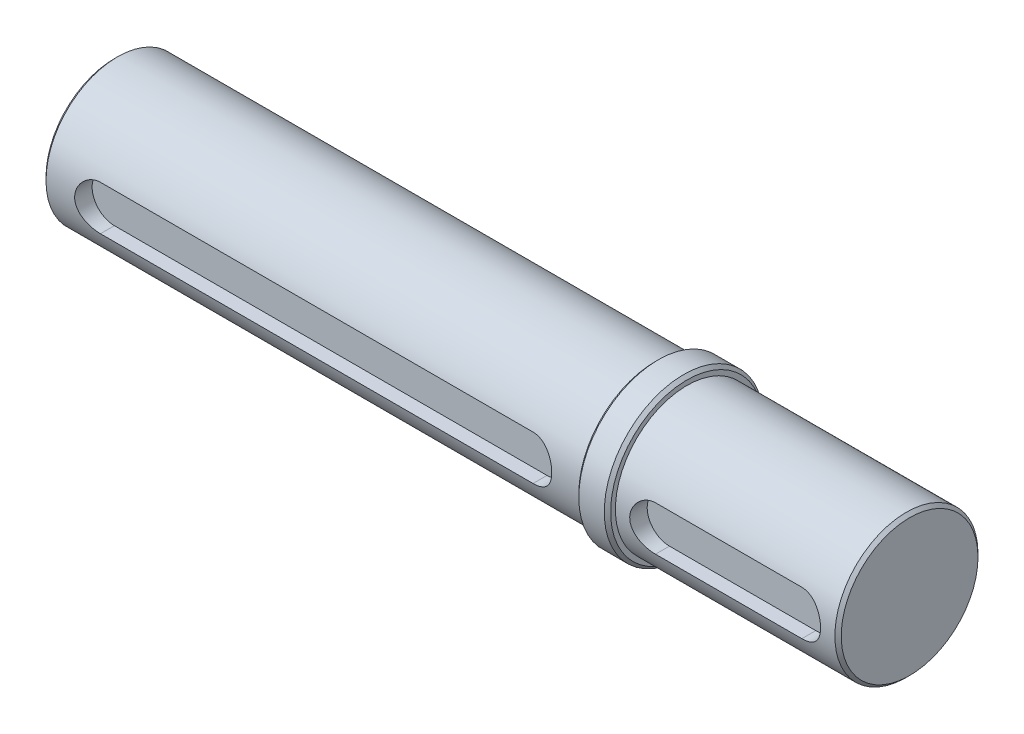
ISO-10303-21;
HEADER;
FILE_DESCRIPTION(('STEP AP214'),'2;1');
FILE_NAME('part.step','',(''),(''),'','','');
FILE_SCHEMA(('AUTOMOTIVE_DESIGN { 1 0 10303 214 1 1 1 1 }'));
ENDSEC;
DATA;
#1=APPLICATION_CONTEXT('core data for automotive mechanical design processes');
#2=APPLICATION_PROTOCOL_DEFINITION('international standard','automotive_design',2000,#1);
#3=PRODUCT_CONTEXT('',#1,'mechanical');
#4=PRODUCT('Part','Part','',(#3));
#5=PRODUCT_RELATED_PRODUCT_CATEGORY('part','',(#4));
#6=PRODUCT_DEFINITION_FORMATION('','',#4);
#7=PRODUCT_DEFINITION_CONTEXT('part definition',#1,'design');
#8=PRODUCT_DEFINITION('design','',#6,#7);
#9=PRODUCT_DEFINITION_SHAPE('','',#8);
#10=(LENGTH_UNIT() NAMED_UNIT(*) SI_UNIT(.MILLI.,.METRE.));
#11=(NAMED_UNIT(*) PLANE_ANGLE_UNIT() SI_UNIT($,.RADIAN.));
#12=(NAMED_UNIT(*) SI_UNIT($,.STERADIAN.) SOLID_ANGLE_UNIT());
#13=UNCERTAINTY_MEASURE_WITH_UNIT(LENGTH_MEASURE(1.E-05),#10,'distance_accuracy_value','');
#14=(GEOMETRIC_REPRESENTATION_CONTEXT(3) GLOBAL_UNCERTAINTY_ASSIGNED_CONTEXT((#13)) GLOBAL_UNIT_ASSIGNED_CONTEXT((#10,
#11,#12)) REPRESENTATION_CONTEXT('',''));
#15=CARTESIAN_POINT('',(0.,0.,0.));
#16=DIRECTION('',(0.,0.,1.));
#17=DIRECTION('',(1.,0.,0.));
#18=AXIS2_PLACEMENT_3D('',#15,#16,#17);
#19=CARTESIAN_POINT('',(0.,0.,0.));
#20=DIRECTION('',(-1.,0.,0.));
#21=DIRECTION('',(0.,0.,1.));
#22=AXIS2_PLACEMENT_3D('',#19,#20,#21);
#23=PLANE('',#22);
#24=CARTESIAN_POINT('',(0.,0.,0.));
#25=DIRECTION('',(-1.,0.,0.));
#26=DIRECTION('',(0.,0.,1.));
#27=AXIS2_PLACEMENT_3D('',#24,#25,#26);
#28=CIRCLE('',#27,21.5);
#29=CARTESIAN_POINT('',(0.,0.,21.5));
#30=VERTEX_POINT('',#29);
#31=EDGE_CURVE('E187',#30,#30,#28,.T.);
#32=ORIENTED_EDGE('',*,*,#31,.T.);
#33=EDGE_LOOP('',(#32));
#34=FACE_BOUND('',#33,.T.);
#35=CARTESIAN_POINT('',(0.,0.,0.));
#36=DIRECTION('',(-1.,0.,0.));
#37=DIRECTION('',(0.,0.,1.));
#38=AXIS2_PLACEMENT_3D('',#35,#36,#37);
#39=CIRCLE('',#38,4.24999999999999);
#40=CARTESIAN_POINT('',(0.,0.,4.24999999999999));
#41=VERTEX_POINT('',#40);
#42=EDGE_CURVE('E159',#41,#41,#39,.T.);
#43=ORIENTED_EDGE('',*,*,#42,.F.);
#44=EDGE_LOOP('',(#43));
#45=FACE_BOUND('',#44,.T.);
#46=ADVANCED_FACE('F45',(#34,#45),#23,.T.);
#47=CARTESIAN_POINT('',(0.,0.,0.));
#48=DIRECTION('',(1.,0.,0.));
#49=DIRECTION('',(0.,0.,-1.));
#50=AXIS2_PLACEMENT_3D('',#47,#48,#49);
#51=CYLINDRICAL_SURFACE('',#50,22.5);
#52=CARTESIAN_POINT('',(153.,-6.99999999999998,21.3834047803431));
#53=CARTESIAN_POINT('',(153.191747962933,-7.00002638788771,21.3833759755726));
#54=CARTESIAN_POINT('',(153.383485321504,-6.99212250357731,21.3859829575454));
#55=CARTESIAN_POINT('',(153.765489058962,-6.96064990633981,21.3962580072183));
#56=CARTESIAN_POINT('',(153.955755778655,-6.93708493994701,21.4039248644627));
#57=CARTESIAN_POINT('',(154.332958103102,-6.87456915635525,21.4240824611325));
#58=CARTESIAN_POINT('',(154.519901235473,-6.83565951993685,21.4365602872848));
#59=CARTESIAN_POINT('',(154.88966229555,-6.74281154744466,21.4659469063578));
#60=CARTESIAN_POINT('',(155.072480102144,-6.68887277075805,21.4828558291851));
#61=CARTESIAN_POINT('',(155.432628173539,-6.56646575510684,21.5205859002674));
#62=CARTESIAN_POINT('',(155.609961967382,-6.49800709263032,21.5414044689111));
#63=CARTESIAN_POINT('',(155.958189970023,-6.34705748516683,21.5863628741255));
#64=CARTESIAN_POINT('',(156.129081759612,-6.26456133146704,21.6105039428957));
#65=CARTESIAN_POINT('',(156.463322979925,-6.08615523684719,21.6614246049305));
#66=CARTESIAN_POINT('',(156.626671560951,-5.99024378964968,21.6882044943834));
#67=CARTESIAN_POINT('',(156.944892740823,-5.78563893862382,21.7436799451747));
#68=CARTESIAN_POINT('',(157.099762274424,-5.67694095648713,21.7723761910783));
#69=CARTESIAN_POINT('',(157.404649878951,-5.44398558349852,21.8318094528287));
#70=CARTESIAN_POINT('',(157.554375697672,-5.31935461263557,21.8625820218381));
#71=CARTESIAN_POINT('',(157.842885258309,-5.05809625572506,21.9244995602668));
#72=CARTESIAN_POINT('',(157.981668816275,-4.92146866808486,21.9556445359364));
#73=CARTESIAN_POINT('',(158.247469283069,-4.63702147167282,22.0174752796029));
#74=CARTESIAN_POINT('',(158.374482110225,-4.48919801262153,22.0481608852367));
#75=CARTESIAN_POINT('',(158.615815118575,-4.18336601580312,22.1082274768052));
#76=CARTESIAN_POINT('',(158.730139713703,-4.02536105036414,22.1376089142809));
#77=CARTESIAN_POINT('',(158.94782013432,-3.69637926494409,22.1949382761817));
#78=CARTESIAN_POINT('',(159.050865802136,-3.52518859648668,22.222838133295));
#79=CARTESIAN_POINT('',(159.242077396034,-3.17432985879871,22.2756613074277));
#80=CARTESIAN_POINT('',(159.33024877474,-2.99466492710897,22.3005857142056));
#81=CARTESIAN_POINT('',(159.491027505679,-2.62804567748407,22.3467560378169));
#82=CARTESIAN_POINT('',(159.563635279951,-2.44109155737343,22.3680020543947));
#83=CARTESIAN_POINT('',(159.692644415018,-2.06124657398026,22.4061975627029));
#84=CARTESIAN_POINT('',(159.749046375157,-1.86835593054215,22.4231472133242));
#85=CARTESIAN_POINT('',(159.843645794008,-1.48406965496813,22.4518043567541));
#86=CARTESIAN_POINT('',(159.882347442615,-1.29280885191943,22.4636563728524));
#87=CARTESIAN_POINT('',(159.943666983921,-0.907492281435927,22.4825189363242));
#88=CARTESIAN_POINT('',(159.966285431422,-0.713436610647583,22.4895296507013));
#89=CARTESIAN_POINT('',(159.995221071183,-0.324029619574403,22.4985094688896));
#90=CARTESIAN_POINT('',(160.001540971608,-0.12867851994682,22.5004794102745));
#91=CARTESIAN_POINT('',(159.997825624669,0.261850976266974,22.4993235348161));
#92=CARTESIAN_POINT('',(159.987790702297,0.457029376207832,22.4961978192299));
#93=CARTESIAN_POINT('',(159.952091279248,0.839016651756687,22.4851350756934));
#94=CARTESIAN_POINT('',(159.926977198409,1.02588219704708,22.4773675290497));
#95=CARTESIAN_POINT('',(159.861806715502,1.39681014394022,22.4573691656826));
#96=CARTESIAN_POINT('',(159.821745326667,1.58087158867604,22.4451368594423));
#97=CARTESIAN_POINT('',(159.727040771032,1.9448049822526,22.4165350301791));
#98=CARTESIAN_POINT('',(159.672402466504,2.12467830636908,22.4001668868012));
#99=CARTESIAN_POINT('',(159.548962208332,2.47918052521276,22.3637078769714));
#100=CARTESIAN_POINT('',(159.480154922154,2.65380741699503,22.3436156092208));
#101=CARTESIAN_POINT('',(159.328027310215,2.99866751070753,22.2999677081418));
#102=CARTESIAN_POINT('',(159.244545249901,3.1688245114741,22.2763739905048));
#103=CARTESIAN_POINT('',(159.064226510845,3.50156811170553,22.2265007734939));
#104=CARTESIAN_POINT('',(158.967385253138,3.66415208979078,22.2002203540359));
#105=CARTESIAN_POINT('',(158.761038630503,3.98072025747788,22.1456467231703));
#106=CARTESIAN_POINT('',(158.651532951898,4.13470423393205,22.1173534619146));
#107=CARTESIAN_POINT('',(158.420570196103,4.43317367604059,22.0594670226099));
#108=CARTESIAN_POINT('',(158.299112742727,4.57765884247862,22.0298738036607));
#109=CARTESIAN_POINT('',(158.039724709995,4.86207108102337,21.9688936108202));
#110=CARTESIAN_POINT('',(157.901320039388,5.0015610920034,21.9374831254957));
#111=CARTESIAN_POINT('',(157.613294186339,5.26840074524966,21.8749338799794));
#112=CARTESIAN_POINT('',(157.463676595185,5.39575424517762,21.8437950363228));
#113=CARTESIAN_POINT('',(157.154016640235,5.63762072887128,21.7826262792731));
#114=CARTESIAN_POINT('',(156.993967320647,5.75212500350362,21.7525971271591));
#115=CARTESIAN_POINT('',(156.664603799852,5.96735827855914,21.6945398510365));
#116=CARTESIAN_POINT('',(156.495293241572,6.06809264161731,21.6665109500826));
#117=CARTESIAN_POINT('',(156.14635431279,6.25621355677313,21.6129469743072));
#118=CARTESIAN_POINT('',(155.966626662005,6.34342581409759,21.5874457842966));
#119=CARTESIAN_POINT('',(155.60003436718,6.5022849484282,21.5401290954628));
#120=CARTESIAN_POINT('',(155.413172696296,6.57393822826239,21.5183120813529));
#121=CARTESIAN_POINT('',(155.033782862087,6.70102264969054,21.4790763704547));
#122=CARTESIAN_POINT('',(154.841260960584,6.75647102650286,21.4616530033951));
#123=CARTESIAN_POINT('',(154.451885948128,6.85070294339751,21.4317592713336));
#124=CARTESIAN_POINT('',(154.255034871999,6.88949414394964,21.4192866297424));
#125=CARTESIAN_POINT('',(153.881992589154,6.9464619866315,21.4008759333036));
#126=CARTESIAN_POINT('',(153.706118439217,6.96653718585294,21.3943385336146));
#127=CARTESIAN_POINT('',(153.353500657659,6.99330547974967,21.3855959359006));
#128=CARTESIAN_POINT('',(153.176758618322,7.0000175656023,21.3833845899213));
#129=CARTESIAN_POINT('',(153.,7.00000000000003,21.3834047803431));
#130=B_SPLINE_CURVE_WITH_KNOTS('',3,(#52,#53,#54,#55,#56,#57,#58,#59,#60,#61,#62,#63,#64,#65,
#66,#67,#68,#69,#70,#71,#72,#73,#74,#75,#76,#77,#78,#79,#80,#81,#82,#83,#84,#85,#86,#87,#88,#89,
#90,#91,#92,#93,#94,#95,#96,#97,#98,#99,#100,#101,#102,#103,#104,#105,#106,#107,#108,#109,#110,
#111,#112,#113,#114,#115,#116,#117,#118,#119,#120,#121,#122,#123,#124,#125,#126,#127,#128,#129),
.UNSPECIFIED.,.F.,.F.,(4,2,2,2,2,2,2,2,2,2,2,2,2,2,2,2,2,2,2,2,2,2,2,2,2,2,2,2,2,2,2,2,2,2,2,2,
2,2,4),(0.,0.575046969806876,1.14995642305857,1.72333336736907,2.29672712327432,
2.86974387087755,3.44297370600939,4.01626795548502,4.58976810539891,5.18076864034281,
5.77177910843488,6.36299375708566,6.95400208730357,7.55850874723004,8.1627933229332,
8.76706151008845,9.37130734653419,9.95706552574569,10.5428034978567,11.1284441375358,
11.7140731399452,12.2795246614735,12.8451649995771,13.4106168982253,13.9762819963941,
14.5486246379559,15.1211639439558,15.6937174338258,16.2662889507273,16.8625896714317,
17.4587002177891,18.055212394766,18.6514915966369,19.2549115963138,19.8580828040919,
20.4606101364131,21.0628600748604,21.5937197869136,22.1238245201084),.UNSPECIFIED.);
#131=CARTESIAN_POINT('',(153.,-6.99999999999998,21.3834047803431));
#132=VERTEX_POINT('',#131);
#133=CARTESIAN_POINT('',(153.,7.00000000000003,21.3834047803431));
#134=VERTEX_POINT('',#133);
#135=EDGE_CURVE('E243',#132,#134,#130,.T.);
#136=ORIENTED_EDGE('',*,*,#135,.F.);
#137=DIRECTION('',(1.,0.,0.));
#138=VECTOR('',#137,1.);
#139=CARTESIAN_POINT('',(0.,-7.,21.3834047803431));
#140=LINE('',#139,#138);
#141=CARTESIAN_POINT('',(17.,-7.,21.3834047803431));
#142=VERTEX_POINT('',#141);
#143=EDGE_CURVE('E11',#142,#132,#140,.T.);
#144=ORIENTED_EDGE('',*,*,#143,.F.);
#145=CARTESIAN_POINT('',(17.,7.,21.3834047803431));
#146=CARTESIAN_POINT('',(16.8082520370671,7.00002638788773,21.3833759755726));
#147=CARTESIAN_POINT('',(16.6165146784963,6.99212250357733,21.3859829575454));
#148=CARTESIAN_POINT('',(16.2345109410377,6.96064990633983,21.3962580072183));
#149=CARTESIAN_POINT('',(16.0442442213453,6.93708493994703,21.4039248644627));
#150=CARTESIAN_POINT('',(15.6670418968984,6.87456915635527,21.4240824611325));
#151=CARTESIAN_POINT('',(15.4800987645274,6.83565951993687,21.4365602872848));
#152=CARTESIAN_POINT('',(15.1103377044495,6.74281154744467,21.4659469063578));
#153=CARTESIAN_POINT('',(14.9275198978557,6.68887277075807,21.4828558291851));
#154=CARTESIAN_POINT('',(14.5673718264613,6.56646575510685,21.5205859002674));
#155=CARTESIAN_POINT('',(14.3900380326178,6.49800709263033,21.5414044689111));
#156=CARTESIAN_POINT('',(14.0418100299767,6.34705748516684,21.5863628741255));
#157=CARTESIAN_POINT('',(13.8709182403882,6.26456133146705,21.6105039428957));
#158=CARTESIAN_POINT('',(13.5366770200747,6.0861552368472,21.6614246049305));
#159=CARTESIAN_POINT('',(13.3733284390492,5.99024378964968,21.6882044943834));
#160=CARTESIAN_POINT('',(13.0551072591769,5.78563893862382,21.7436799451747));
#161=CARTESIAN_POINT('',(12.9002377255763,5.67694095648713,21.7723761910783));
#162=CARTESIAN_POINT('',(12.5953501210494,5.44398558349853,21.8318094528287));
#163=CARTESIAN_POINT('',(12.4456243023278,5.31935461263558,21.8625820218381));
#164=CARTESIAN_POINT('',(12.1571147416907,5.05809625572507,21.9244995602668));
#165=CARTESIAN_POINT('',(12.0183311837246,4.92146866808487,21.9556445359364));
#166=CARTESIAN_POINT('',(11.7525307169311,4.63702147167283,22.0174752796029));
#167=CARTESIAN_POINT('',(11.6255178897753,4.48919801262155,22.0481608852367));
#168=CARTESIAN_POINT('',(11.384184881425,4.18336601580314,22.1082274768052));
#169=CARTESIAN_POINT('',(11.2698602862973,4.02536105036415,22.1376089142809));
#170=CARTESIAN_POINT('',(11.05217986568,3.6963792649441,22.1949382761817));
#171=CARTESIAN_POINT('',(10.9491341978637,3.5251885964867,22.222838133295));
#172=CARTESIAN_POINT('',(10.7579226039664,3.17432985879872,22.2756613074277));
#173=CARTESIAN_POINT('',(10.66975122526,2.99466492710898,22.3005857142056));
#174=CARTESIAN_POINT('',(10.5089724943215,2.62804567748407,22.3467560378169));
#175=CARTESIAN_POINT('',(10.4363647200488,2.44109155737343,22.3680020543947));
#176=CARTESIAN_POINT('',(10.3073555849817,2.06124657398027,22.4061975627029));
#177=CARTESIAN_POINT('',(10.2509536248428,1.86835593054215,22.4231472133242));
#178=CARTESIAN_POINT('',(10.1563542059918,1.48406965496813,22.4518043567541));
#179=CARTESIAN_POINT('',(10.1176525573853,1.29280885191943,22.4636563728524));
#180=CARTESIAN_POINT('',(10.0563330160787,0.907492281435925,22.4825189363242));
#181=CARTESIAN_POINT('',(10.0337145685779,0.71343661064758,22.4895296507013));
#182=CARTESIAN_POINT('',(10.0047789288171,0.324029619574398,22.4985094688896));
#183=CARTESIAN_POINT('',(9.99845902839227,0.128678519946814,22.5004794102745));
#184=CARTESIAN_POINT('',(10.0021743753308,-0.261850976266982,22.4993235348161));
#185=CARTESIAN_POINT('',(10.0122092977033,-0.457029376207841,22.4961978192299));
#186=CARTESIAN_POINT('',(10.0479087207522,-0.839016651756698,22.4851350756934));
#187=CARTESIAN_POINT('',(10.0730228015911,-1.0258821970471,22.4773675290497));
#188=CARTESIAN_POINT('',(10.1381932844985,-1.39681014394023,22.4573691656826));
#189=CARTESIAN_POINT('',(10.1782546733331,-1.58087158867605,22.4451368594423));
#190=CARTESIAN_POINT('',(10.2729592289679,-1.94480498225261,22.4165350301791));
#191=CARTESIAN_POINT('',(10.327597533496,-2.12467830636909,22.4001668868012));
#192=CARTESIAN_POINT('',(10.4510377916683,-2.47918052521277,22.3637078769714));
#193=CARTESIAN_POINT('',(10.5198450778458,-2.65380741699504,22.3436156092208));
#194=CARTESIAN_POINT('',(10.6719726897852,-2.99866751070754,22.2999677081418));
#195=CARTESIAN_POINT('',(10.7554547500993,-3.16882451147411,22.2763739905048));
#196=CARTESIAN_POINT('',(10.9357734891551,-3.50156811170554,22.2265007734939));
#197=CARTESIAN_POINT('',(11.0326147468621,-3.66415208979079,22.2002203540359));
#198=CARTESIAN_POINT('',(11.2389613694973,-3.98072025747788,22.1456467231703));
#199=CARTESIAN_POINT('',(11.3484670481018,-4.13470423393206,22.1173534619146));
#200=CARTESIAN_POINT('',(11.5794298038973,-4.4331736760406,22.0594670226099));
#201=CARTESIAN_POINT('',(11.7008872572734,-4.57765884247863,22.0298738036607));
#202=CARTESIAN_POINT('',(11.9602752900053,-4.86207108102338,21.9688936108202));
#203=CARTESIAN_POINT('',(12.0986799606122,-5.00156109200341,21.9374831254957));
#204=CARTESIAN_POINT('',(12.3867058136609,-5.26840074524967,21.8749338799794));
#205=CARTESIAN_POINT('',(12.5363234048154,-5.39575424517763,21.8437950363228));
#206=CARTESIAN_POINT('',(12.8459833597652,-5.63762072887128,21.7826262792731));
#207=CARTESIAN_POINT('',(13.0060326793534,-5.75212500350363,21.7525971271591));
#208=CARTESIAN_POINT('',(13.335396200148,-5.96735827855914,21.6945398510365));
#209=CARTESIAN_POINT('',(13.5047067584282,-6.06809264161731,21.6665109500826));
#210=CARTESIAN_POINT('',(13.8536456872099,-6.25621355677312,21.6129469743072));
#211=CARTESIAN_POINT('',(14.0333733379948,-6.34342581409758,21.5874457842966));
#212=CARTESIAN_POINT('',(14.3999656328203,-6.50228494842818,21.5401290954628));
#213=CARTESIAN_POINT('',(14.5868273037043,-6.57393822826236,21.5183120813529));
#214=CARTESIAN_POINT('',(14.9662171379128,-6.70102264969051,21.4790763704547));
#215=CARTESIAN_POINT('',(15.1587390394159,-6.75647102650283,21.4616530033951));
#216=CARTESIAN_POINT('',(15.5481140518722,-6.85070294339748,21.4317592713336));
#217=CARTESIAN_POINT('',(15.7449651280007,-6.88949414394962,21.4192866297424));
#218=CARTESIAN_POINT('',(16.1180074108463,-6.94646198663148,21.4008759333036));
#219=CARTESIAN_POINT('',(16.2938815607828,-6.96653718585291,21.3943385336146));
#220=CARTESIAN_POINT('',(16.6464993423408,-6.99330547974964,21.3855959359006));
#221=CARTESIAN_POINT('',(16.8232413816784,-7.00001756560227,21.3833845899213));
#222=CARTESIAN_POINT('',(17.,-7.,21.3834047803431));
#223=B_SPLINE_CURVE_WITH_KNOTS('',3,(#145,#146,#147,#148,#149,#150,#151,#152,#153,#154,#155,
#156,#157,#158,#159,#160,#161,#162,#163,#164,#165,#166,#167,#168,#169,#170,#171,#172,#173,#174,
#175,#176,#177,#178,#179,#180,#181,#182,#183,#184,#185,#186,#187,#188,#189,#190,#191,#192,#193,
#194,#195,#196,#197,#198,#199,#200,#201,#202,#203,#204,#205,#206,#207,#208,#209,#210,#211,#212,
#213,#214,#215,#216,#217,#218,#219,#220,#221,#222),.UNSPECIFIED.,.F.,.F.,(4,2,2,2,2,2,2,2,2,2,2,
2,2,2,2,2,2,2,2,2,2,2,2,2,2,2,2,2,2,2,2,2,2,2,2,2,2,2,4),(0.,0.57504696980687,1.14995642305858,
1.72333336736907,2.29672712327433,2.86974387087759,3.44297370600941,4.01626795548503,
4.58976810539893,5.18076864034279,5.77177910843488,6.36299375708563,6.95400208730355,
7.55850874723002,8.16279332293319,8.76706151008845,9.37130734653418,9.95706552574569,
10.5428034978567,11.1284441375358,11.7140731399452,12.2795246614735,12.8451649995772,
13.4106168982253,13.9762819963941,14.5486246379559,15.1211639439558,15.6937174338258,
16.2662889507273,16.8625896714317,17.4587002177891,18.055212394766,18.6514915966369,
19.2549115963138,19.8580828040919,20.460610136413,21.0628600748604,21.5937197869136,
22.1238245201084),.UNSPECIFIED.);
#224=CARTESIAN_POINT('',(17.,7.,21.3834047803431));
#225=VERTEX_POINT('',#224);
#226=EDGE_CURVE('E54',#225,#142,#223,.T.);
#227=ORIENTED_EDGE('',*,*,#226,.F.);
#228=DIRECTION('',(1.,0.,0.));
#229=VECTOR('',#228,1.);
#230=CARTESIAN_POINT('',(0.,7.,21.3834047803431));
#231=LINE('',#230,#229);
#232=EDGE_CURVE('E251',#134,#225,#231,.F.);
#233=ORIENTED_EDGE('',*,*,#232,.F.);
#234=EDGE_LOOP('',(#136,#144,#227,#233));
#235=FACE_BOUND('',#234,.T.);
#236=CARTESIAN_POINT('',(0.999999999999984,0.,0.));
#237=DIRECTION('',(-1.,0.,0.));
#238=DIRECTION('',(0.,0.,1.));
#239=AXIS2_PLACEMENT_3D('',#236,#237,#238);
#240=CIRCLE('',#239,22.5);
#241=CARTESIAN_POINT('',(0.999999999999984,0.,22.5));
#242=VERTEX_POINT('',#241);
#243=EDGE_CURVE('E184',#242,#242,#240,.F.);
#244=ORIENTED_EDGE('',*,*,#243,.T.);
#245=EDGE_LOOP('',(#244));
#246=FACE_BOUND('',#245,.T.);
#247=CARTESIAN_POINT('',(170.,0.,0.));
#248=DIRECTION('',(1.,0.,0.));
#249=DIRECTION('',(0.,0.,-1.));
#250=AXIS2_PLACEMENT_3D('',#247,#248,#249);
#251=CIRCLE('',#250,22.5);
#252=CARTESIAN_POINT('',(170.,0.,-22.5));
#253=VERTEX_POINT('',#252);
#254=EDGE_CURVE('E175',#253,#253,#251,.T.);
#255=ORIENTED_EDGE('',*,*,#254,.F.);
#256=EDGE_LOOP('',(#255));
#257=FACE_BOUND('',#256,.T.);
#258=ADVANCED_FACE('F252',(#235,#246,#257),#51,.T.);
#259=CARTESIAN_POINT('',(170.,22.5,0.));
#260=DIRECTION('',(-1.,0.,0.));
#261=DIRECTION('',(0.,0.,1.));
#262=AXIS2_PLACEMENT_3D('',#259,#260,#261);
#263=PLANE('',#262);
#264=CARTESIAN_POINT('',(170.,0.,0.));
#265=DIRECTION('',(-1.,0.,0.));
#266=DIRECTION('',(0.,0.,1.));
#267=AXIS2_PLACEMENT_3D('',#264,#265,#266);
#268=CIRCLE('',#267,24.);
#269=CARTESIAN_POINT('',(170.,0.,24.));
#270=VERTEX_POINT('',#269);
#271=EDGE_CURVE('E196',#270,#270,#268,.T.);
#272=ORIENTED_EDGE('',*,*,#271,.T.);
#273=EDGE_LOOP('',(#272));
#274=FACE_BOUND('',#273,.T.);
#275=ORIENTED_EDGE('',*,*,#254,.T.);
#276=EDGE_LOOP('',(#275));
#277=FACE_BOUND('',#276,.T.);
#278=ADVANCED_FACE('F278',(#274,#277),#263,.T.);
#279=CARTESIAN_POINT('',(0.,0.,0.));
#280=DIRECTION('',(1.,0.,0.));
#281=DIRECTION('',(0.,0.,-1.));
#282=AXIS2_PLACEMENT_3D('',#279,#280,#281);
#283=CYLINDRICAL_SURFACE('',#282,25.);
#284=CARTESIAN_POINT('',(171.,0.,0.));
#285=DIRECTION('',(-1.,0.,0.));
#286=DIRECTION('',(0.,0.,1.));
#287=AXIS2_PLACEMENT_3D('',#284,#285,#286);
#288=CIRCLE('',#287,25.);
#289=CARTESIAN_POINT('',(171.,0.,25.));
#290=VERTEX_POINT('',#289);
#291=EDGE_CURVE('E193',#290,#290,#288,.F.);
#292=ORIENTED_EDGE('',*,*,#291,.T.);
#293=EDGE_LOOP('',(#292));
#294=FACE_BOUND('',#293,.T.);
#295=CARTESIAN_POINT('',(179.,0.,0.));
#296=DIRECTION('',(1.,0.,0.));
#297=DIRECTION('',(0.,0.,-1.));
#298=AXIS2_PLACEMENT_3D('',#295,#296,#297);
#299=CIRCLE('',#298,25.);
#300=CARTESIAN_POINT('',(179.,0.,-25.));
#301=VERTEX_POINT('',#300);
#302=EDGE_CURVE('E190',#301,#301,#299,.F.);
#303=ORIENTED_EDGE('',*,*,#302,.T.);
#304=EDGE_LOOP('',(#303));
#305=FACE_BOUND('',#304,.T.);
#306=ADVANCED_FACE('F284',(#294,#305),#283,.T.);
#307=CARTESIAN_POINT('',(180.,25.,0.));
#308=DIRECTION('',(1.,0.,0.));
#309=DIRECTION('',(0.,0.,-1.));
#310=AXIS2_PLACEMENT_3D('',#307,#308,#309);
#311=PLANE('',#310);
#312=CARTESIAN_POINT('',(180.,0.,0.));
#313=DIRECTION('',(1.,0.,0.));
#314=DIRECTION('',(0.,0.,-1.));
#315=AXIS2_PLACEMENT_3D('',#312,#313,#314);
#316=CIRCLE('',#315,24.0000000000001);
#317=CARTESIAN_POINT('',(180.,0.,-24.0000000000001));
#318=VERTEX_POINT('',#317);
#319=EDGE_CURVE('E199',#318,#318,#316,.T.);
#320=ORIENTED_EDGE('',*,*,#319,.T.);
#321=EDGE_LOOP('',(#320));
#322=FACE_BOUND('',#321,.T.);
#323=CARTESIAN_POINT('',(180.,0.,0.));
#324=DIRECTION('',(1.,0.,0.));
#325=DIRECTION('',(0.,0.,-1.));
#326=AXIS2_PLACEMENT_3D('',#323,#324,#325);
#327=CIRCLE('',#326,22.5);
#328=CARTESIAN_POINT('',(180.,0.,-22.5));
#329=VERTEX_POINT('',#328);
#330=EDGE_CURVE('E172',#329,#329,#327,.T.);
#331=ORIENTED_EDGE('',*,*,#330,.F.);
#332=EDGE_LOOP('',(#331));
#333=FACE_BOUND('',#332,.T.);
#334=ADVANCED_FACE('F290',(#322,#333),#311,.T.);
#335=CARTESIAN_POINT('',(0.,0.,0.));
#336=DIRECTION('',(1.,0.,0.));
#337=DIRECTION('',(0.,0.,-1.));
#338=AXIS2_PLACEMENT_3D('',#335,#336,#337);
#339=CYLINDRICAL_SURFACE('',#338,22.5);
#340=CARTESIAN_POINT('',(191.5,6.99999999999999,21.3834047803431));
#341=CARTESIAN_POINT('',(191.308252037067,7.00002638788773,21.3833759755726));
#342=CARTESIAN_POINT('',(191.116514678496,6.99212250357732,21.3859829575454));
#343=CARTESIAN_POINT('',(190.734510941038,6.96064990633983,21.3962580072183));
#344=CARTESIAN_POINT('',(190.544244221345,6.93708493994702,21.4039248644628));
#345=CARTESIAN_POINT('',(190.167041896898,6.87456915635526,21.4240824611325));
#346=CARTESIAN_POINT('',(189.980098764527,6.83565951993686,21.4365602872848));
#347=CARTESIAN_POINT('',(189.610337704449,6.74281154744466,21.4659469063578));
#348=CARTESIAN_POINT('',(189.427519897856,6.68887277075806,21.4828558291851));
#349=CARTESIAN_POINT('',(189.067371826461,6.56646575510684,21.5205859002674));
#350=CARTESIAN_POINT('',(188.890038032618,6.49800709263032,21.5414044689112));
#351=CARTESIAN_POINT('',(188.541810029977,6.34705748516683,21.5863628741255));
#352=CARTESIAN_POINT('',(188.370918240388,6.26456133146704,21.6105039428958));
#353=CARTESIAN_POINT('',(188.036677020075,6.08615523684718,21.6614246049305));
#354=CARTESIAN_POINT('',(187.873328439049,5.99024378964967,21.6882044943834));
#355=CARTESIAN_POINT('',(187.555107259177,5.78563893862381,21.7436799451747));
#356=CARTESIAN_POINT('',(187.400237725576,5.67694095648712,21.7723761910784));
#357=CARTESIAN_POINT('',(187.095350121049,5.44398558349851,21.8318094528287));
#358=CARTESIAN_POINT('',(186.945624302328,5.31935461263557,21.8625820218381));
#359=CARTESIAN_POINT('',(186.657114741691,5.05809625572506,21.9244995602668));
#360=CARTESIAN_POINT('',(186.518331183725,4.92146866808484,21.9556445359364));
#361=CARTESIAN_POINT('',(186.252530716931,4.6370214716728,22.0174752796029));
#362=CARTESIAN_POINT('',(186.125517889775,4.48919801262152,22.0481608852368));
#363=CARTESIAN_POINT('',(185.884184881425,4.18336601580312,22.1082274768052));
#364=CARTESIAN_POINT('',(185.769860286297,4.02536105036413,22.137608914281));
#365=CARTESIAN_POINT('',(185.55217986568,3.69637926494408,22.1949382761817));
#366=CARTESIAN_POINT('',(185.449134197864,3.52518859648667,22.222838133295));
#367=CARTESIAN_POINT('',(185.257922603966,3.17432985879869,22.2756613074277));
#368=CARTESIAN_POINT('',(185.16975122526,2.99466492710895,22.3005857142056));
#369=CARTESIAN_POINT('',(185.008972494321,2.62804567748403,22.3467560378169));
#370=CARTESIAN_POINT('',(184.936364720049,2.44109155737338,22.3680020543948));
#371=CARTESIAN_POINT('',(184.807355584982,2.06124657398022,22.4061975627029));
#372=CARTESIAN_POINT('',(184.750953624843,1.8683559305421,22.4231472133242));
#373=CARTESIAN_POINT('',(184.656354205992,1.48406965496808,22.4518043567541));
#374=CARTESIAN_POINT('',(184.617652557385,1.29280885191938,22.4636563728524));
#375=CARTESIAN_POINT('',(184.556333016079,0.907492281435878,22.4825189363242));
#376=CARTESIAN_POINT('',(184.533714568578,0.713436610647533,22.4895296507014));
#377=CARTESIAN_POINT('',(184.504778928817,0.324029619574352,22.4985094688896));
#378=CARTESIAN_POINT('',(184.498459028392,0.128678519946769,22.5004794102745));
#379=CARTESIAN_POINT('',(184.502174375331,-0.261850976267025,22.4993235348162));
#380=CARTESIAN_POINT('',(184.512209297703,-0.457029376207884,22.4961978192299));
#381=CARTESIAN_POINT('',(184.547908720752,-0.839016651756739,22.4851350756934));
#382=CARTESIAN_POINT('',(184.573022801591,-1.02588219704714,22.4773675290497));
#383=CARTESIAN_POINT('',(184.638193284498,-1.39681014394027,22.4573691656826));
#384=CARTESIAN_POINT('',(184.678254673333,-1.58087158867609,22.4451368594423));
#385=CARTESIAN_POINT('',(184.772959228968,-1.94480498225266,22.4165350301791));
#386=CARTESIAN_POINT('',(184.827597533496,-2.12467830636914,22.4001668868012));
#387=CARTESIAN_POINT('',(184.951037791668,-2.47918052521281,22.3637078769714));
#388=CARTESIAN_POINT('',(185.019845077846,-2.65380741699509,22.3436156092208));
#389=CARTESIAN_POINT('',(185.171972689785,-2.99866751070759,22.2999677081418));
#390=CARTESIAN_POINT('',(185.255454750099,-3.16882451147417,22.2763739905048));
#391=CARTESIAN_POINT('',(185.435773489155,-3.50156811170561,22.2265007734939));
#392=CARTESIAN_POINT('',(185.532614746862,-3.66415208979086,22.200220354036));
#393=CARTESIAN_POINT('',(185.738961369497,-3.98072025747795,22.1456467231703));
#394=CARTESIAN_POINT('',(185.848467048102,-4.13470423393213,22.1173534619146));
#395=CARTESIAN_POINT('',(186.079429803897,-4.43317367604066,22.0594670226099));
#396=CARTESIAN_POINT('',(186.200887257273,-4.57765884247868,22.0298738036607));
#397=CARTESIAN_POINT('',(186.460275290005,-4.86207108102343,21.9688936108202));
#398=CARTESIAN_POINT('',(186.598679960612,-5.00156109200347,21.9374831254957));
#399=CARTESIAN_POINT('',(186.886705813661,-5.26840074524973,21.8749338799794));
#400=CARTESIAN_POINT('',(187.036323404815,-5.39575424517769,21.8437950363228));
#401=CARTESIAN_POINT('',(187.345983359765,-5.63762072887135,21.7826262792731));
#402=CARTESIAN_POINT('',(187.506032679353,-5.75212500350369,21.7525971271591));
#403=CARTESIAN_POINT('',(187.835396200148,-5.9673582785592,21.6945398510365));
#404=CARTESIAN_POINT('',(188.004706758428,-6.06809264161736,21.6665109500826));
#405=CARTESIAN_POINT('',(188.35364568721,-6.25621355677317,21.6129469743072));
#406=CARTESIAN_POINT('',(188.533373337995,-6.34342581409764,21.5874457842966));
#407=CARTESIAN_POINT('',(188.89996563282,-6.50228494842824,21.5401290954628));
#408=CARTESIAN_POINT('',(189.086827303704,-6.57393822826241,21.5183120813529));
#409=CARTESIAN_POINT('',(189.466217137913,-6.70102264969056,21.4790763704547));
#410=CARTESIAN_POINT('',(189.658739039416,-6.75647102650288,21.4616530033951));
#411=CARTESIAN_POINT('',(190.048114051872,-6.85070294339753,21.4317592713336));
#412=CARTESIAN_POINT('',(190.244965128001,-6.88949414394967,21.4192866297424));
#413=CARTESIAN_POINT('',(190.618007410846,-6.94646198663152,21.4008759333036));
#414=CARTESIAN_POINT('',(190.793881560783,-6.96653718585296,21.3943385336146));
#415=CARTESIAN_POINT('',(191.146499342341,-6.99330547974969,21.3855959359007));
#416=CARTESIAN_POINT('',(191.323241381678,-7.00001756560232,21.3833845899213));
#417=CARTESIAN_POINT('',(191.5,-7.00000000000004,21.3834047803431));
#418=B_SPLINE_CURVE_WITH_KNOTS('',3,(#340,#341,#342,#343,#344,#345,#346,#347,#348,#349,#350,
#351,#352,#353,#354,#355,#356,#357,#358,#359,#360,#361,#362,#363,#364,#365,#366,#367,#368,#369,
#370,#371,#372,#373,#374,#375,#376,#377,#378,#379,#380,#381,#382,#383,#384,#385,#386,#387,#388,
#389,#390,#391,#392,#393,#394,#395,#396,#397,#398,#399,#400,#401,#402,#403,#404,#405,#406,#407,
#408,#409,#410,#411,#412,#413,#414,#415,#416,#417),.UNSPECIFIED.,.F.,.F.,(4,2,2,2,2,2,2,2,2,2,2,
2,2,2,2,2,2,2,2,2,2,2,2,2,2,2,2,2,2,2,2,2,2,2,2,2,2,2,4),(0.,0.575046969806877,1.1499564230586,
1.7233333673691,2.29672712327436,2.86974387087759,3.44297370600943,4.01626795548503,
4.58976810539895,5.18076864034281,5.77177910843491,6.36299375708567,6.95400208730359,
7.55850874723005,8.16279332293324,8.76706151008852,9.37130734653424,9.95706552574575,
10.5428034978567,11.1284441375359,11.7140731399453,12.2795246614735,12.8451649995772,
13.4106168982253,13.9762819963942,14.548624637956,15.1211639439559,15.6937174338259,
16.2662889507274,16.8625896714318,17.4587002177892,18.0552123947661,18.651491596637,
19.2549115963139,19.8580828040919,20.4606101364131,21.0628600748606,21.5937197869137,
22.1238245201084),.UNSPECIFIED.);
#419=CARTESIAN_POINT('',(191.5,6.99999999999999,21.3834047803431));
#420=VERTEX_POINT('',#419);
#421=CARTESIAN_POINT('',(191.5,-7.00000000000002,21.3834047803431));
#422=VERTEX_POINT('',#421);
#423=EDGE_CURVE('E202',#420,#422,#418,.T.);
#424=ORIENTED_EDGE('',*,*,#423,.F.);
#425=DIRECTION('',(1.,0.,0.));
#426=VECTOR('',#425,1.);
#427=CARTESIAN_POINT('',(0.,6.99999999999995,21.3834047803431));
#428=LINE('',#427,#426);
#429=CARTESIAN_POINT('',(237.5,7.00000000000003,21.3834047803431));
#430=VERTEX_POINT('',#429);
#431=EDGE_CURVE('E241',#430,#420,#428,.F.);
#432=ORIENTED_EDGE('',*,*,#431,.F.);
#433=CARTESIAN_POINT('',(237.5,-7.00000000000003,21.3834047803431));
#434=CARTESIAN_POINT('',(237.691747962933,-7.00002638788776,21.3833759755726));
#435=CARTESIAN_POINT('',(237.883485321504,-6.99212250357736,21.3859829575454));
#436=CARTESIAN_POINT('',(238.265489058962,-6.96064990633986,21.3962580072183));
#437=CARTESIAN_POINT('',(238.455755778655,-6.93708493994706,21.4039248644627));
#438=CARTESIAN_POINT('',(238.832958103102,-6.8745691563553,21.4240824611325));
#439=CARTESIAN_POINT('',(239.019901235473,-6.8356595199369,21.4365602872848));
#440=CARTESIAN_POINT('',(239.38966229555,-6.7428115474447,21.4659469063578));
#441=CARTESIAN_POINT('',(239.572480102144,-6.68887277075809,21.4828558291851));
#442=CARTESIAN_POINT('',(239.932628173539,-6.56646575510687,21.5205859002674));
#443=CARTESIAN_POINT('',(240.109961967382,-6.49800709263035,21.5414044689111));
#444=CARTESIAN_POINT('',(240.458189970023,-6.34705748516686,21.5863628741255));
#445=CARTESIAN_POINT('',(240.629081759612,-6.26456133146707,21.6105039428958));
#446=CARTESIAN_POINT('',(240.963322979925,-6.08615523684721,21.6614246049305));
#447=CARTESIAN_POINT('',(241.126671560951,-5.99024378964969,21.6882044943834));
#448=CARTESIAN_POINT('',(241.444892740823,-5.78563893862382,21.7436799451747));
#449=CARTESIAN_POINT('',(241.599762274424,-5.67694095648713,21.7723761910784));
#450=CARTESIAN_POINT('',(241.904649878951,-5.44398558349852,21.8318094528287));
#451=CARTESIAN_POINT('',(242.054375697672,-5.31935461263556,21.8625820218381));
#452=CARTESIAN_POINT('',(242.342885258309,-5.05809625572506,21.9244995602668));
#453=CARTESIAN_POINT('',(242.481668816275,-4.92146866808486,21.9556445359364));
#454=CARTESIAN_POINT('',(242.747469283069,-4.63702147167283,22.0174752796029));
#455=CARTESIAN_POINT('',(242.874482110225,-4.48919801262155,22.0481608852367));
#456=CARTESIAN_POINT('',(243.115815118575,-4.18336601580314,22.1082274768052));
#457=CARTESIAN_POINT('',(243.230139713703,-4.02536105036416,22.1376089142809));
#458=CARTESIAN_POINT('',(243.44782013432,-3.69637926494412,22.1949382761817));
#459=CARTESIAN_POINT('',(243.550865802136,-3.52518859648671,22.222838133295));
#460=CARTESIAN_POINT('',(243.742077396034,-3.17432985879873,22.2756613074277));
#461=CARTESIAN_POINT('',(243.83024877474,-2.99466492710899,22.3005857142056));
#462=CARTESIAN_POINT('',(243.991027505679,-2.62804567748408,22.3467560378169));
#463=CARTESIAN_POINT('',(244.063635279951,-2.44109155737343,22.3680020543948));
#464=CARTESIAN_POINT('',(244.192644415018,-2.06124657398027,22.4061975627029));
#465=CARTESIAN_POINT('',(244.249046375157,-1.86835593054215,22.4231472133242));
#466=CARTESIAN_POINT('',(244.343645794008,-1.48406965496812,22.4518043567541));
#467=CARTESIAN_POINT('',(244.382347442615,-1.29280885191942,22.4636563728524));
#468=CARTESIAN_POINT('',(244.443666983921,-0.907492281435915,22.4825189363242));
#469=CARTESIAN_POINT('',(244.466285431422,-0.713436610647567,22.4895296507014));
#470=CARTESIAN_POINT('',(244.495221071183,-0.32402961957438,22.4985094688896));
#471=CARTESIAN_POINT('',(244.501540971608,-0.128678519946794,22.5004794102745));
#472=CARTESIAN_POINT('',(244.497825624669,0.261850976267005,22.4993235348162));
#473=CARTESIAN_POINT('',(244.487790702297,0.457029376207865,22.4961978192299));
#474=CARTESIAN_POINT('',(244.452091279248,0.839016651756722,22.4851350756934));
#475=CARTESIAN_POINT('',(244.426977198409,1.02588219704712,22.4773675290497));
#476=CARTESIAN_POINT('',(244.361806715502,1.39681014394026,22.4573691656826));
#477=CARTESIAN_POINT('',(244.321745326667,1.58087158867607,22.4451368594423));
#478=CARTESIAN_POINT('',(244.227040771032,1.94480498225264,22.4165350301791));
#479=CARTESIAN_POINT('',(244.172402466504,2.12467830636912,22.4001668868012));
#480=CARTESIAN_POINT('',(244.048962208332,2.47918052521279,22.3637078769714));
#481=CARTESIAN_POINT('',(243.980154922154,2.65380741699507,22.3436156092208));
#482=CARTESIAN_POINT('',(243.828027310215,2.99866751070757,22.2999677081418));
#483=CARTESIAN_POINT('',(243.744545249901,3.16882451147414,22.2763739905048));
#484=CARTESIAN_POINT('',(243.564226510845,3.50156811170556,22.2265007734939));
#485=CARTESIAN_POINT('',(243.467385253138,3.66415208979081,22.200220354036));
#486=CARTESIAN_POINT('',(243.261038630503,3.9807202574779,22.1456467231703));
#487=CARTESIAN_POINT('',(243.151532951898,4.13470423393209,22.1173534619146));
#488=CARTESIAN_POINT('',(242.920570196103,4.43317367604063,22.0594670226099));
#489=CARTESIAN_POINT('',(242.799112742727,4.57765884247866,22.0298738036607));
#490=CARTESIAN_POINT('',(242.539724709995,4.86207108102341,21.9688936108202));
#491=CARTESIAN_POINT('',(242.401320039388,5.00156109200344,21.9374831254957));
#492=CARTESIAN_POINT('',(242.113294186339,5.2684007452497,21.8749338799794));
#493=CARTESIAN_POINT('',(241.963676595185,5.39575424517766,21.8437950363228));
#494=CARTESIAN_POINT('',(241.654016640235,5.63762072887132,21.7826262792731));
#495=CARTESIAN_POINT('',(241.493967320647,5.75212500350367,21.7525971271591));
#496=CARTESIAN_POINT('',(241.164603799852,5.96735827855918,21.6945398510365));
#497=CARTESIAN_POINT('',(240.995293241572,6.06809264161735,21.6665109500826));
#498=CARTESIAN_POINT('',(240.64635431279,6.25621355677315,21.6129469743072));
#499=CARTESIAN_POINT('',(240.466626662005,6.34342581409761,21.5874457842966));
#500=CARTESIAN_POINT('',(240.10003436718,6.50228494842821,21.5401290954628));
#501=CARTESIAN_POINT('',(239.913172696296,6.5739382282624,21.5183120813529));
#502=CARTESIAN_POINT('',(239.533782862087,6.70102264969055,21.4790763704547));
#503=CARTESIAN_POINT('',(239.341260960584,6.75647102650287,21.4616530033951));
#504=CARTESIAN_POINT('',(238.951885948128,6.85070294339752,21.4317592713336));
#505=CARTESIAN_POINT('',(238.755034871999,6.88949414394966,21.4192866297424));
#506=CARTESIAN_POINT('',(238.381992589154,6.94646198663151,21.4008759333036));
#507=CARTESIAN_POINT('',(238.206118439217,6.96653718585294,21.3943385336146));
#508=CARTESIAN_POINT('',(237.853500657659,6.99330547974967,21.3855959359007));
#509=CARTESIAN_POINT('',(237.676758618322,7.0000175656023,21.3833845899213));
#510=CARTESIAN_POINT('',(237.5,7.00000000000003,21.3834047803431));
#511=B_SPLINE_CURVE_WITH_KNOTS('',3,(#433,#434,#435,#436,#437,#438,#439,#440,#441,#442,#443,
#444,#445,#446,#447,#448,#449,#450,#451,#452,#453,#454,#455,#456,#457,#458,#459,#460,#461,#462,
#463,#464,#465,#466,#467,#468,#469,#470,#471,#472,#473,#474,#475,#476,#477,#478,#479,#480,#481,
#482,#483,#484,#485,#486,#487,#488,#489,#490,#491,#492,#493,#494,#495,#496,#497,#498,#499,#500,
#501,#502,#503,#504,#505,#506,#507,#508,#509,#510),.UNSPECIFIED.,.F.,.F.,(4,2,2,2,2,2,2,2,2,2,2,
2,2,2,2,2,2,2,2,2,2,2,2,2,2,2,2,2,2,2,2,2,2,2,2,2,2,2,4),(0.,0.575046969806849,1.14995642305857,
1.72333336736907,2.29672712327436,2.86974387087759,3.44297370600943,4.01626795548509,
4.58976810539898,5.18076864034286,5.77177910843493,6.36299375708567,6.95400208730358,
7.55850874723005,8.16279332293322,8.7670615100885,9.37130734653423,9.95706552574574,
10.5428034978567,11.1284441375359,11.7140731399453,12.2795246614736,12.8451649995772,
13.4106168982254,13.9762819963942,14.548624637956,15.1211639439559,15.6937174338259,
16.2662889507274,16.8625896714318,17.4587002177892,18.0552123947661,18.651491596637,
19.2549115963139,19.858082804092,20.4606101364132,21.0628600748606,21.5937197869137,
22.1238245201085),.UNSPECIFIED.);
#512=CARTESIAN_POINT('',(237.5,-7.00000000000003,21.3834047803431));
#513=VERTEX_POINT('',#512);
#514=EDGE_CURVE('E235',#513,#430,#511,.T.);
#515=ORIENTED_EDGE('',*,*,#514,.F.);
#516=DIRECTION('',(1.,0.,0.));
#517=VECTOR('',#516,1.);
#518=CARTESIAN_POINT('',(0.,-7.,21.3834047803431));
#519=LINE('',#518,#517);
#520=EDGE_CURVE('E210',#422,#513,#519,.T.);
#521=ORIENTED_EDGE('',*,*,#520,.F.);
#522=EDGE_LOOP('',(#424,#432,#515,#521));
#523=FACE_BOUND('',#522,.T.);
#524=CARTESIAN_POINT('',(249.,0.,0.));
#525=DIRECTION('',(1.,0.,0.));
#526=DIRECTION('',(0.,0.,-1.));
#527=AXIS2_PLACEMENT_3D('',#524,#525,#526);
#528=CIRCLE('',#527,22.5);
#529=CARTESIAN_POINT('',(249.,0.,-22.5));
#530=VERTEX_POINT('',#529);
#531=EDGE_CURVE('E181',#530,#530,#528,.F.);
#532=ORIENTED_EDGE('',*,*,#531,.T.);
#533=EDGE_LOOP('',(#532));
#534=FACE_BOUND('',#533,.T.);
#535=ORIENTED_EDGE('',*,*,#330,.T.);
#536=EDGE_LOOP('',(#535));
#537=FACE_BOUND('',#536,.T.);
#538=ADVANCED_FACE('F212',(#523,#534,#537),#339,.T.);
#539=CARTESIAN_POINT('',(250.,22.5,0.));
#540=DIRECTION('',(1.,0.,0.));
#541=DIRECTION('',(0.,0.,-1.));
#542=AXIS2_PLACEMENT_3D('',#539,#540,#541);
#543=PLANE('',#542);
#544=CARTESIAN_POINT('',(250.,0.,0.));
#545=DIRECTION('',(1.,0.,0.));
#546=DIRECTION('',(0.,0.,-1.));
#547=AXIS2_PLACEMENT_3D('',#544,#545,#546);
#548=CIRCLE('',#547,21.5);
#549=CARTESIAN_POINT('',(250.,0.,-21.5));
#550=VERTEX_POINT('',#549);
#551=EDGE_CURVE('E178',#550,#550,#548,.T.);
#552=ORIENTED_EDGE('',*,*,#551,.T.);
#553=EDGE_LOOP('',(#552));
#554=FACE_BOUND('',#553,.T.);
#555=ADVANCED_FACE('F335',(#554),#543,.T.);
#556=CARTESIAN_POINT('',(52.5,0.,0.));
#557=DIRECTION('',(-1.,0.,0.));
#558=DIRECTION('',(0.,0.,1.));
#559=AXIS2_PLACEMENT_3D('',#556,#557,#558);
#560=CONICAL_SURFACE('',#559,4.24999999999999,1.02974425867665);
#561=CARTESIAN_POINT('',(55.0536576308671,0.,0.));
#562=VERTEX_POINT('',#561);
#563=VERTEX_LOOP('',#562);
#564=FACE_BOUND('',#563,.T.);
#565=CARTESIAN_POINT('',(52.5,0.,0.));
#566=DIRECTION('',(-1.,0.,0.));
#567=DIRECTION('',(0.,0.,1.));
#568=AXIS2_PLACEMENT_3D('',#565,#566,#567);
#569=CIRCLE('',#568,4.24999999999999);
#570=CARTESIAN_POINT('',(52.5,0.,4.24999999999999));
#571=VERTEX_POINT('',#570);
#572=EDGE_CURVE('E169',#571,#571,#569,.T.);
#573=ORIENTED_EDGE('',*,*,#572,.T.);
#574=EDGE_LOOP('',(#573));
#575=FACE_BOUND('',#574,.T.);
#576=ADVANCED_FACE('F340',(#564,#575),#560,.F.);
#577=CARTESIAN_POINT('',(0.,0.,0.));
#578=DIRECTION('',(-1.,0.,0.));
#579=DIRECTION('',(0.,0.,1.));
#580=AXIS2_PLACEMENT_3D('',#577,#578,#579);
#581=CYLINDRICAL_SURFACE('',#580,4.24999999999999);
#582=ORIENTED_EDGE('',*,*,#572,.F.);
#583=EDGE_LOOP('',(#582));
#584=FACE_BOUND('',#583,.T.);
#585=ORIENTED_EDGE('',*,*,#42,.T.);
#586=EDGE_LOOP('',(#585));
#587=FACE_BOUND('',#586,.T.);
#588=ADVANCED_FACE('F233',(#584,#587),#581,.F.);
#589=CARTESIAN_POINT('',(250.,0.,0.));
#590=DIRECTION('',(-1.,0.,0.));
#591=DIRECTION('',(0.,0.,1.));
#592=AXIS2_PLACEMENT_3D('',#589,#590,#591);
#593=CONICAL_SURFACE('',#592,21.5,0.785398163397421);
#594=ORIENTED_EDGE('',*,*,#531,.F.);
#595=EDGE_LOOP('',(#594));
#596=FACE_BOUND('',#595,.T.);
#597=ORIENTED_EDGE('',*,*,#551,.F.);
#598=EDGE_LOOP('',(#597));
#599=FACE_BOUND('',#598,.T.);
#600=ADVANCED_FACE('F300',(#596,#599),#593,.T.);
#601=CARTESIAN_POINT('',(0.999999999999984,0.,0.));
#602=DIRECTION('',(1.,0.,0.));
#603=DIRECTION('',(0.,0.,-1.));
#604=AXIS2_PLACEMENT_3D('',#601,#602,#603);
#605=CONICAL_SURFACE('',#604,22.5,0.78539816339746);
#606=ORIENTED_EDGE('',*,*,#31,.F.);
#607=EDGE_LOOP('',(#606));
#608=FACE_BOUND('',#607,.T.);
#609=ORIENTED_EDGE('',*,*,#243,.F.);
#610=EDGE_LOOP('',(#609));
#611=FACE_BOUND('',#610,.T.);
#612=ADVANCED_FACE('F306',(#608,#611),#605,.T.);
#613=CARTESIAN_POINT('',(171.,0.,0.));
#614=DIRECTION('',(1.,0.,0.));
#615=DIRECTION('',(0.,0.,-1.));
#616=AXIS2_PLACEMENT_3D('',#613,#614,#615);
#617=CONICAL_SURFACE('',#616,25.,0.785398163397435);
#618=ORIENTED_EDGE('',*,*,#271,.F.);
#619=EDGE_LOOP('',(#618));
#620=FACE_BOUND('',#619,.T.);
#621=ORIENTED_EDGE('',*,*,#291,.F.);
#622=EDGE_LOOP('',(#621));
#623=FACE_BOUND('',#622,.T.);
#624=ADVANCED_FACE('F312',(#620,#623),#617,.T.);
#625=CARTESIAN_POINT('',(180.,0.,0.));
#626=DIRECTION('',(-1.,0.,0.));
#627=DIRECTION('',(0.,0.,1.));
#628=AXIS2_PLACEMENT_3D('',#625,#626,#627);
#629=CONICAL_SURFACE('',#628,24.0000000000001,0.785398163397448);
#630=ORIENTED_EDGE('',*,*,#302,.F.);
#631=EDGE_LOOP('',(#630));
#632=FACE_BOUND('',#631,.T.);
#633=ORIENTED_EDGE('',*,*,#319,.F.);
#634=EDGE_LOOP('',(#633));
#635=FACE_BOUND('',#634,.T.);
#636=ADVANCED_FACE('F48',(#632,#635),#629,.T.);
#637=CARTESIAN_POINT('',(237.5,0.,17.));
#638=DIRECTION('',(0.,0.,1.));
#639=DIRECTION('',(1.,0.,0.));
#640=AXIS2_PLACEMENT_3D('',#637,#638,#639);
#641=CYLINDRICAL_SURFACE('',#640,7.00000000000003);
#642=DIRECTION('',(0.,0.,1.));
#643=VECTOR('',#642,1.);
#644=CARTESIAN_POINT('',(237.5,-7.00000000000003,17.));
#645=LINE('',#644,#643);
#646=CARTESIAN_POINT('',(237.5,-7.00000000000003,17.));
#647=VERTEX_POINT('',#646);
#648=EDGE_CURVE('E156',#647,#513,#645,.T.);
#649=ORIENTED_EDGE('',*,*,#648,.T.);
#650=ORIENTED_EDGE('',*,*,#514,.T.);
#651=DIRECTION('',(0.,0.,1.));
#652=VECTOR('',#651,1.);
#653=CARTESIAN_POINT('',(237.5,7.00000000000003,17.));
#654=LINE('',#653,#652);
#655=CARTESIAN_POINT('',(237.5,7.00000000000003,17.));
#656=VERTEX_POINT('',#655);
#657=EDGE_CURVE('E68',#656,#430,#654,.T.);
#658=ORIENTED_EDGE('',*,*,#657,.F.);
#659=CARTESIAN_POINT('',(237.5,0.,17.));
#660=DIRECTION('',(0.,0.,1.));
#661=DIRECTION('',(1.,0.,0.));
#662=AXIS2_PLACEMENT_3D('',#659,#660,#661);
#663=CIRCLE('',#662,7.00000000000003);
#664=EDGE_CURVE('E140',#647,#656,#663,.T.);
#665=ORIENTED_EDGE('',*,*,#664,.F.);
#666=EDGE_LOOP('',(#649,#650,#658,#665));
#667=FACE_BOUND('',#666,.T.);
#668=ADVANCED_FACE('F228',(#667),#641,.F.);
#669=CARTESIAN_POINT('',(237.5,-7.00000000000003,17.));
#670=DIRECTION('',(0.,-1.,0.));
#671=DIRECTION('',(1.,0.,0.));
#672=AXIS2_PLACEMENT_3D('',#669,#670,#671);
#673=PLANE('',#672);
#674=ORIENTED_EDGE('',*,*,#520,.T.);
#675=ORIENTED_EDGE('',*,*,#648,.F.);
#676=DIRECTION('',(1.,0.,0.));
#677=VECTOR('',#676,1.);
#678=CARTESIAN_POINT('',(237.5,-7.00000000000003,17.));
#679=LINE('',#678,#677);
#680=CARTESIAN_POINT('',(191.5,-7.00000000000002,17.));
#681=VERTEX_POINT('',#680);
#682=EDGE_CURVE('E153',#681,#647,#679,.T.);
#683=ORIENTED_EDGE('',*,*,#682,.F.);
#684=DIRECTION('',(0.,0.,1.));
#685=VECTOR('',#684,1.);
#686=CARTESIAN_POINT('',(191.5,-7.00000000000002,17.));
#687=LINE('',#686,#685);
#688=EDGE_CURVE('E160',#681,#422,#687,.T.);
#689=ORIENTED_EDGE('',*,*,#688,.T.);
#690=EDGE_LOOP('',(#674,#675,#683,#689));
#691=FACE_BOUND('',#690,.T.);
#692=ADVANCED_FACE('F222',(#691),#673,.F.);
#693=CARTESIAN_POINT('',(191.5,0.,17.));
#694=DIRECTION('',(0.,0.,1.));
#695=DIRECTION('',(1.,0.,0.));
#696=AXIS2_PLACEMENT_3D('',#693,#694,#695);
#697=CYLINDRICAL_SURFACE('',#696,7.00000000000002);
#698=DIRECTION('',(0.,0.,1.));
#699=VECTOR('',#698,1.);
#700=CARTESIAN_POINT('',(191.5,6.99999999999999,17.));
#701=LINE('',#700,#699);
#702=CARTESIAN_POINT('',(191.5,6.99999999999999,17.));
#703=VERTEX_POINT('',#702);
#704=EDGE_CURVE('E163',#703,#420,#701,.T.);
#705=ORIENTED_EDGE('',*,*,#704,.T.);
#706=ORIENTED_EDGE('',*,*,#423,.T.);
#707=ORIENTED_EDGE('',*,*,#688,.F.);
#708=CARTESIAN_POINT('',(191.5,0.,17.));
#709=DIRECTION('',(0.,0.,1.));
#710=DIRECTION('',(1.,0.,0.));
#711=AXIS2_PLACEMENT_3D('',#708,#709,#710);
#712=CIRCLE('',#711,7.00000000000002);
#713=EDGE_CURVE('E150',#703,#681,#712,.T.);
#714=ORIENTED_EDGE('',*,*,#713,.F.);
#715=EDGE_LOOP('',(#705,#706,#707,#714));
#716=FACE_BOUND('',#715,.T.);
#717=ADVANCED_FACE('F216',(#716),#697,.F.);
#718=CARTESIAN_POINT('',(237.5,7.00000000000003,17.));
#719=DIRECTION('',(0.,1.,0.));
#720=DIRECTION('',(-1.,0.,0.));
#721=AXIS2_PLACEMENT_3D('',#718,#719,#720);
#722=PLANE('',#721);
#723=ORIENTED_EDGE('',*,*,#431,.T.);
#724=ORIENTED_EDGE('',*,*,#704,.F.);
#725=DIRECTION('',(-1.,0.,0.));
#726=VECTOR('',#725,1.);
#727=CARTESIAN_POINT('',(237.5,7.00000000000003,17.));
#728=LINE('',#727,#726);
#729=EDGE_CURVE('E147',#656,#703,#728,.T.);
#730=ORIENTED_EDGE('',*,*,#729,.F.);
#731=ORIENTED_EDGE('',*,*,#657,.T.);
#732=EDGE_LOOP('',(#723,#724,#730,#731));
#733=FACE_BOUND('',#732,.T.);
#734=ADVANCED_FACE('F221',(#733),#722,.F.);
#735=CARTESIAN_POINT('',(237.5,0.,17.));
#736=DIRECTION('',(0.,0.,1.));
#737=DIRECTION('',(1.,0.,0.));
#738=AXIS2_PLACEMENT_3D('',#735,#736,#737);
#739=PLANE('',#738);
#740=ORIENTED_EDGE('',*,*,#664,.T.);
#741=ORIENTED_EDGE('',*,*,#729,.T.);
#742=ORIENTED_EDGE('',*,*,#713,.T.);
#743=ORIENTED_EDGE('',*,*,#682,.T.);
#744=EDGE_LOOP('',(#740,#741,#742,#743));
#745=FACE_BOUND('',#744,.T.);
#746=ADVANCED_FACE('F227',(#745),#739,.T.);
#747=CARTESIAN_POINT('',(17.,0.,17.));
#748=DIRECTION('',(0.,0.,1.));
#749=DIRECTION('',(1.,0.,0.));
#750=AXIS2_PLACEMENT_3D('',#747,#748,#749);
#751=CYLINDRICAL_SURFACE('',#750,7.);
#752=DIRECTION('',(0.,0.,1.));
#753=VECTOR('',#752,1.);
#754=CARTESIAN_POINT('',(17.,7.,17.));
#755=LINE('',#754,#753);
#756=CARTESIAN_POINT('',(17.,7.,17.));
#757=VERTEX_POINT('',#756);
#758=EDGE_CURVE('E138',#757,#225,#755,.T.);
#759=ORIENTED_EDGE('',*,*,#758,.T.);
#760=ORIENTED_EDGE('',*,*,#226,.T.);
#761=DIRECTION('',(0.,0.,1.));
#762=VECTOR('',#761,1.);
#763=CARTESIAN_POINT('',(17.,-7.,17.));
#764=LINE('',#763,#762);
#765=CARTESIAN_POINT('',(17.,-7.,17.));
#766=VERTEX_POINT('',#765);
#767=EDGE_CURVE('E60',#766,#142,#764,.T.);
#768=ORIENTED_EDGE('',*,*,#767,.F.);
#769=CARTESIAN_POINT('',(17.,0.,17.));
#770=DIRECTION('',(0.,0.,1.));
#771=DIRECTION('',(1.,0.,0.));
#772=AXIS2_PLACEMENT_3D('',#769,#770,#771);
#773=CIRCLE('',#772,7.);
#774=EDGE_CURVE('E117',#757,#766,#773,.T.);
#775=ORIENTED_EDGE('',*,*,#774,.F.);
#776=EDGE_LOOP('',(#759,#760,#768,#775));
#777=FACE_BOUND('',#776,.T.);
#778=ADVANCED_FACE('F115',(#777),#751,.F.);
#779=CARTESIAN_POINT('',(17.,7.,17.));
#780=DIRECTION('',(0.,1.,0.));
#781=DIRECTION('',(-1.,0.,0.));
#782=AXIS2_PLACEMENT_3D('',#779,#780,#781);
#783=PLANE('',#782);
#784=ORIENTED_EDGE('',*,*,#232,.T.);
#785=ORIENTED_EDGE('',*,*,#758,.F.);
#786=DIRECTION('',(-1.,0.,0.));
#787=VECTOR('',#786,1.);
#788=CARTESIAN_POINT('',(17.,7.,17.));
#789=LINE('',#788,#787);
#790=CARTESIAN_POINT('',(153.,7.00000000000003,17.));
#791=VERTEX_POINT('',#790);
#792=EDGE_CURVE('E121',#791,#757,#789,.T.);
#793=ORIENTED_EDGE('',*,*,#792,.F.);
#794=DIRECTION('',(0.,0.,1.));
#795=VECTOR('',#794,1.);
#796=CARTESIAN_POINT('',(153.,7.00000000000003,17.));
#797=LINE('',#796,#795);
#798=EDGE_CURVE('E141',#791,#134,#797,.T.);
#799=ORIENTED_EDGE('',*,*,#798,.T.);
#800=EDGE_LOOP('',(#784,#785,#793,#799));
#801=FACE_BOUND('',#800,.T.);
#802=ADVANCED_FACE('F261',(#801),#783,.F.);
#803=CARTESIAN_POINT('',(153.,0.,17.));
#804=DIRECTION('',(0.,0.,1.));
#805=DIRECTION('',(1.,0.,0.));
#806=AXIS2_PLACEMENT_3D('',#803,#804,#805);
#807=CYLINDRICAL_SURFACE('',#806,7.);
#808=DIRECTION('',(0.,0.,1.));
#809=VECTOR('',#808,1.);
#810=CARTESIAN_POINT('',(153.,-6.99999999999998,17.));
#811=LINE('',#810,#809);
#812=CARTESIAN_POINT('',(153.,-6.99999999999998,17.));
#813=VERTEX_POINT('',#812);
#814=EDGE_CURVE('E120',#813,#132,#811,.T.);
#815=ORIENTED_EDGE('',*,*,#814,.T.);
#816=ORIENTED_EDGE('',*,*,#135,.T.);
#817=ORIENTED_EDGE('',*,*,#798,.F.);
#818=CARTESIAN_POINT('',(153.,0.,17.));
#819=DIRECTION('',(0.,0.,1.));
#820=DIRECTION('',(1.,0.,0.));
#821=AXIS2_PLACEMENT_3D('',#818,#819,#820);
#822=CIRCLE('',#821,7.);
#823=EDGE_CURVE('E130',#813,#791,#822,.T.);
#824=ORIENTED_EDGE('',*,*,#823,.F.);
#825=EDGE_LOOP('',(#815,#816,#817,#824));
#826=FACE_BOUND('',#825,.T.);
#827=ADVANCED_FACE('F256',(#826),#807,.F.);
#828=CARTESIAN_POINT('',(17.,-7.,17.));
#829=DIRECTION('',(0.,-1.,0.));
#830=DIRECTION('',(1.,0.,0.));
#831=AXIS2_PLACEMENT_3D('',#828,#829,#830);
#832=PLANE('',#831);
#833=ORIENTED_EDGE('',*,*,#143,.T.);
#834=ORIENTED_EDGE('',*,*,#814,.F.);
#835=DIRECTION('',(1.,0.,0.));
#836=VECTOR('',#835,1.);
#837=CARTESIAN_POINT('',(17.,-7.,17.));
#838=LINE('',#837,#836);
#839=EDGE_CURVE('E124',#766,#813,#838,.T.);
#840=ORIENTED_EDGE('',*,*,#839,.F.);
#841=ORIENTED_EDGE('',*,*,#767,.T.);
#842=EDGE_LOOP('',(#833,#834,#840,#841));
#843=FACE_BOUND('',#842,.T.);
#844=ADVANCED_FACE('F125',(#843),#832,.F.);
#845=CARTESIAN_POINT('',(17.,0.,17.));
#846=DIRECTION('',(0.,0.,1.));
#847=DIRECTION('',(1.,0.,0.));
#848=AXIS2_PLACEMENT_3D('',#845,#846,#847);
#849=PLANE('',#848);
#850=ORIENTED_EDGE('',*,*,#774,.T.);
#851=ORIENTED_EDGE('',*,*,#839,.T.);
#852=ORIENTED_EDGE('',*,*,#823,.T.);
#853=ORIENTED_EDGE('',*,*,#792,.T.);
#854=EDGE_LOOP('',(#850,#851,#852,#853));
#855=FACE_BOUND('',#854,.T.);
#856=ADVANCED_FACE('F132',(#855),#849,.T.);
#857=CLOSED_SHELL('',(#46,#258,#278,#306,#334,#538,#555,#576,#588,#600,#612,#624,#636,#668,#692,
#717,#734,#746,#778,#802,#827,#844,#856));
#858=MANIFOLD_SOLID_BREP('B2',#857);
#859=ADVANCED_BREP_SHAPE_REPRESENTATION('',(#18,#858),#14);
#860=SHAPE_DEFINITION_REPRESENTATION(#9,#859);
ENDSEC;
END-ISO-10303-21;
